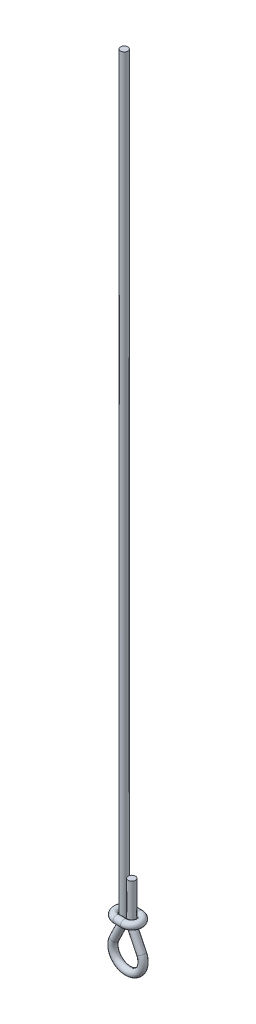
ISO-10303-21;
HEADER;
FILE_DESCRIPTION(('STEP AP214'),'2;1');
FILE_NAME('part.step','',(''),(''),'','','');
FILE_SCHEMA(('AUTOMOTIVE_DESIGN { 1 0 10303 214 1 1 1 1 }'));
ENDSEC;
DATA;
#1=APPLICATION_CONTEXT('core data for automotive mechanical design processes');
#2=APPLICATION_PROTOCOL_DEFINITION('international standard','automotive_design',2000,#1);
#3=PRODUCT_CONTEXT('',#1,'mechanical');
#4=PRODUCT('Part','Part','',(#3));
#5=PRODUCT_RELATED_PRODUCT_CATEGORY('part','',(#4));
#6=PRODUCT_DEFINITION_FORMATION('','',#4);
#7=PRODUCT_DEFINITION_CONTEXT('part definition',#1,'design');
#8=PRODUCT_DEFINITION('design','',#6,#7);
#9=PRODUCT_DEFINITION_SHAPE('','',#8);
#10=(LENGTH_UNIT() NAMED_UNIT(*) SI_UNIT(.MILLI.,.METRE.));
#11=(NAMED_UNIT(*) PLANE_ANGLE_UNIT() SI_UNIT($,.RADIAN.));
#12=(NAMED_UNIT(*) SI_UNIT($,.STERADIAN.) SOLID_ANGLE_UNIT());
#13=UNCERTAINTY_MEASURE_WITH_UNIT(LENGTH_MEASURE(1.E-05),#10,'distance_accuracy_value','');
#14=(GEOMETRIC_REPRESENTATION_CONTEXT(3) GLOBAL_UNCERTAINTY_ASSIGNED_CONTEXT((#13)) GLOBAL_UNIT_ASSIGNED_CONTEXT((#10,
#11,#12)) REPRESENTATION_CONTEXT('',''));
#15=CARTESIAN_POINT('',(0.,0.,0.));
#16=DIRECTION('',(0.,0.,1.));
#17=DIRECTION('',(1.,0.,0.));
#18=AXIS2_PLACEMENT_3D('',#15,#16,#17);
#19=CARTESIAN_POINT('',(1.5,1.,0.));
#20=DIRECTION('',(0.,-1.,0.));
#21=DIRECTION('',(0.,0.,-1.));
#22=AXIS2_PLACEMENT_3D('',#19,#20,#21);
#23=TOROIDAL_SURFACE('',#22,1.5,0.725);
#24=CARTESIAN_POINT('',(1.5,1.,-1.5));
#25=DIRECTION('',(-1.,0.,0.));
#26=DIRECTION('',(0.,0.,1.));
#27=AXIS2_PLACEMENT_3D('',#24,#25,#26);
#28=CIRCLE('',#27,0.725);
#29=CARTESIAN_POINT('',(1.5,1.,-2.225));
#30=VERTEX_POINT('',#29);
#31=EDGE_CURVE('E84',#30,#30,#28,.T.);
#32=CARTESIAN_POINT('',(1.5,1.,1.5));
#33=DIRECTION('',(1.,0.,0.));
#34=DIRECTION('',(0.,0.,-1.));
#35=AXIS2_PLACEMENT_3D('',#32,#33,#34);
#36=CIRCLE('',#35,0.725);
#37=CARTESIAN_POINT('',(1.5,1.,2.225));
#38=VERTEX_POINT('',#37);
#39=EDGE_CURVE('E80',#38,#38,#36,.T.);
#40=CARTESIAN_POINT('',(1.5,1.,0.));
#41=DIRECTION('',(0.,-1.,0.));
#42=DIRECTION('',(0.,0.,-1.));
#43=AXIS2_PLACEMENT_3D('',#40,#41,#42);
#44=CIRCLE('',#43,2.225);
#45=EDGE_CURVE('',#30,#38,#44,.T.);
#46=ORIENTED_EDGE('',*,*,#31,.F.);
#47=ORIENTED_EDGE('',*,*,#39,.T.);
#48=ORIENTED_EDGE('',*,*,#45,.T.);
#49=ORIENTED_EDGE('',*,*,#45,.F.);
#50=EDGE_LOOP('',(#46,#48,#47,#49));
#51=FACE_BOUND('',#50,.T.);
#52=ADVANCED_FACE('F69',(#51),#23,.T.);
#53=CARTESIAN_POINT('',(1.5,1.,1.5));
#54=DIRECTION('',(-1.,0.,0.));
#55=DIRECTION('',(0.,0.,1.));
#56=AXIS2_PLACEMENT_3D('',#53,#54,#55);
#57=CYLINDRICAL_SURFACE('',#56,0.725);
#58=CARTESIAN_POINT('',(0.,1.,1.5));
#59=DIRECTION('',(1.,0.,0.));
#60=DIRECTION('',(0.,0.,-1.));
#61=AXIS2_PLACEMENT_3D('',#58,#59,#60);
#62=CIRCLE('',#61,0.725);
#63=CARTESIAN_POINT('',(0.,1.,2.225));
#64=VERTEX_POINT('',#63);
#65=EDGE_CURVE('E76',#64,#64,#62,.T.);
#66=ORIENTED_EDGE('',*,*,#65,.T.);
#67=EDGE_LOOP('',(#66));
#68=FACE_BOUND('',#67,.T.);
#69=ORIENTED_EDGE('',*,*,#39,.F.);
#70=EDGE_LOOP('',(#69));
#71=FACE_BOUND('',#70,.T.);
#72=ADVANCED_FACE('F93',(#68,#71),#57,.T.);
#73=CARTESIAN_POINT('',(0.,1.,0.));
#74=DIRECTION('',(0.,-1.,0.));
#75=DIRECTION('',(0.,0.,-1.));
#76=AXIS2_PLACEMENT_3D('',#73,#74,#75);
#77=TOROIDAL_SURFACE('',#76,1.5,0.725);
#78=CARTESIAN_POINT('',(0.,1.,-1.5));
#79=DIRECTION('',(-1.,0.,0.));
#80=DIRECTION('',(0.,0.,1.));
#81=AXIS2_PLACEMENT_3D('',#78,#79,#80);
#82=CIRCLE('',#81,0.725);
#83=CARTESIAN_POINT('',(0.,1.,-2.225));
#84=VERTEX_POINT('',#83);
#85=EDGE_CURVE('E12',#84,#84,#82,.T.);
#86=CARTESIAN_POINT('',(0.,1.,0.));
#87=DIRECTION('',(0.,-1.,0.));
#88=DIRECTION('',(0.,0.,-1.));
#89=AXIS2_PLACEMENT_3D('',#86,#87,#88);
#90=CIRCLE('',#89,2.225);
#91=EDGE_CURVE('',#64,#84,#90,.T.);
#92=ORIENTED_EDGE('',*,*,#65,.F.);
#93=ORIENTED_EDGE('',*,*,#85,.T.);
#94=ORIENTED_EDGE('',*,*,#91,.T.);
#95=ORIENTED_EDGE('',*,*,#91,.F.);
#96=EDGE_LOOP('',(#92,#94,#93,#95));
#97=FACE_BOUND('',#96,.T.);
#98=ADVANCED_FACE('F99',(#97),#77,.T.);
#99=CARTESIAN_POINT('',(0.,1.,-1.5));
#100=DIRECTION('',(1.,0.,0.));
#101=DIRECTION('',(0.,0.,-1.));
#102=AXIS2_PLACEMENT_3D('',#99,#100,#101);
#103=CYLINDRICAL_SURFACE('',#102,0.725);
#104=ORIENTED_EDGE('',*,*,#31,.T.);
#105=EDGE_LOOP('',(#104));
#106=FACE_BOUND('',#105,.T.);
#107=ORIENTED_EDGE('',*,*,#85,.F.);
#108=EDGE_LOOP('',(#107));
#109=FACE_BOUND('',#108,.T.);
#110=ADVANCED_FACE('F71',(#106,#109),#103,.T.);
#111=CLOSED_SHELL('',(#52,#72,#98,#110));
#112=MANIFOLD_SOLID_BREP('B2',#111);
#113=CARTESIAN_POINT('',(1.5,8.,0.));
#114=DIRECTION('',(0.,-1.,0.));
#115=DIRECTION('',(0.,0.,-1.));
#116=AXIS2_PLACEMENT_3D('',#113,#114,#115);
#117=PLANE('',#116);
#118=CARTESIAN_POINT('',(1.5,8.,0.));
#119=DIRECTION('',(0.,-1.,0.));
#120=DIRECTION('',(0.,0.,-1.));
#121=AXIS2_PLACEMENT_3D('',#118,#119,#120);
#122=CIRCLE('',#121,0.725);
#123=CARTESIAN_POINT('',(1.5,8.,-0.725));
#124=VERTEX_POINT('',#123);
#125=EDGE_CURVE('E142',#124,#124,#122,.T.);
#126=ORIENTED_EDGE('',*,*,#125,.F.);
#127=EDGE_LOOP('',(#126));
#128=FACE_BOUND('',#127,.T.);
#129=ADVANCED_FACE('F139',(#128),#117,.F.);
#130=CARTESIAN_POINT('',(0.,150.,0.));
#131=DIRECTION('',(0.,1.,0.));
#132=DIRECTION('',(0.,0.,-1.));
#133=AXIS2_PLACEMENT_3D('',#130,#131,#132);
#134=PLANE('',#133);
#135=CARTESIAN_POINT('',(0.,150.,0.));
#136=DIRECTION('',(0.,1.,0.));
#137=DIRECTION('',(0.,0.,-1.));
#138=AXIS2_PLACEMENT_3D('',#135,#136,#137);
#139=CIRCLE('',#138,0.725);
#140=CARTESIAN_POINT('',(0.,150.,-0.725));
#141=VERTEX_POINT('',#140);
#142=EDGE_CURVE('E146',#141,#141,#139,.T.);
#143=ORIENTED_EDGE('',*,*,#142,.T.);
#144=EDGE_LOOP('',(#143));
#145=FACE_BOUND('',#144,.T.);
#146=ADVANCED_FACE('F179',(#145),#134,.T.);
#147=CARTESIAN_POINT('',(1.5,-0.467624888717495,0.));
#148=DIRECTION('',(0.,1.,0.));
#149=DIRECTION('',(0.,0.,1.));
#150=AXIS2_PLACEMENT_3D('',#147,#148,#149);
#151=CYLINDRICAL_SURFACE('',#150,0.725);
#152=CARTESIAN_POINT('',(1.5,0.,0.));
#153=DIRECTION('',(-0.224597295491527,0.974451668815797,0.));
#154=DIRECTION('',(-0.974451668815797,-0.224597295491527,0.));
#155=AXIS2_PLACEMENT_3D('',#152,#153,#154);
#156=ELLIPSE('',#155,0.744008167055691,0.725);
#157=CARTESIAN_POINT('',(0.774999999999998,-0.167102222144317,0.));
#158=VERTEX_POINT('',#157);
#159=EDGE_CURVE('E157',#158,#158,#156,.T.);
#160=ORIENTED_EDGE('',*,*,#159,.T.);
#161=EDGE_LOOP('',(#160));
#162=FACE_BOUND('',#161,.T.);
#163=ORIENTED_EDGE('',*,*,#125,.T.);
#164=EDGE_LOOP('',(#163));
#165=FACE_BOUND('',#164,.T.);
#166=ADVANCED_FACE('F173',(#162,#165),#151,.T.);
#167=CARTESIAN_POINT('',(3.44733632914735,-4.00000000000001,0.));
#168=DIRECTION('',(-0.437718418806466,0.899112109715784,0.));
#169=DIRECTION('',(-0.899112109715784,-0.437718418806466,0.));
#170=AXIS2_PLACEMENT_3D('',#167,#168,#169);
#171=CYLINDRICAL_SURFACE('',#170,0.725);
#172=CARTESIAN_POINT('',(3.44733632914735,-4.,0.));
#173=DIRECTION('',(0.437718418806466,-0.899112109715784,0.));
#174=DIRECTION('',(0.,0.,-1.));
#175=AXIS2_PLACEMENT_3D('',#172,#173,#174);
#176=CIRCLE('',#175,0.725);
#177=CARTESIAN_POINT('',(4.0991926086913,-3.68265414636532,0.));
#178=VERTEX_POINT('',#177);
#179=EDGE_CURVE('E154',#178,#178,#176,.T.);
#180=ORIENTED_EDGE('',*,*,#179,.F.);
#181=EDGE_LOOP('',(#180));
#182=FACE_BOUND('',#181,.T.);
#183=ORIENTED_EDGE('',*,*,#159,.F.);
#184=EDGE_LOOP('',(#183));
#185=FACE_BOUND('',#184,.T.);
#186=ADVANCED_FACE('F167',(#182,#185),#171,.T.);
#187=CARTESIAN_POINT('',(0.75,-5.3131552564194,0.));
#188=DIRECTION('',(0.,0.,1.));
#189=DIRECTION('',(1.,0.,0.));
#190=AXIS2_PLACEMENT_3D('',#187,#188,#189);
#191=TOROIDAL_SURFACE('',#190,3.,0.725);
#192=CARTESIAN_POINT('',(-1.94733632914735,-4.,0.));
#193=DIRECTION('',(0.437718418806466,0.899112109715784,0.));
#194=DIRECTION('',(0.,0.,-1.));
#195=AXIS2_PLACEMENT_3D('',#192,#193,#194);
#196=CIRCLE('',#195,0.725);
#197=CARTESIAN_POINT('',(-2.59919260869129,-3.68265414636531,0.));
#198=VERTEX_POINT('',#197);
#199=EDGE_CURVE('E151',#198,#198,#196,.T.);
#200=CARTESIAN_POINT('',(0.75,-5.3131552564194,0.));
#201=DIRECTION('',(0.,0.,1.));
#202=DIRECTION('',(1.,0.,0.));
#203=AXIS2_PLACEMENT_3D('',#200,#201,#202);
#204=CIRCLE('',#203,3.725);
#205=EDGE_CURVE('',#198,#178,#204,.T.);
#206=ORIENTED_EDGE('',*,*,#199,.F.);
#207=ORIENTED_EDGE('',*,*,#179,.T.);
#208=ORIENTED_EDGE('',*,*,#205,.T.);
#209=ORIENTED_EDGE('',*,*,#205,.F.);
#210=EDGE_LOOP('',(#206,#208,#207,#209));
#211=FACE_BOUND('',#210,.T.);
#212=ADVANCED_FACE('F164',(#211),#191,.T.);
#213=CARTESIAN_POINT('',(0.204688026883972,0.420447200250397,0.));
#214=DIRECTION('',(-0.437718418806466,-0.899112109715783,0.));
#215=DIRECTION('',(0.899112109715784,-0.437718418806466,0.));
#216=AXIS2_PLACEMENT_3D('',#213,#214,#215);
#217=CYLINDRICAL_SURFACE('',#216,0.725);
#218=CARTESIAN_POINT('',(0.,0.,0.));
#219=DIRECTION('',(-0.224597295491527,-0.974451668815797,0.));
#220=DIRECTION('',(0.974451668815797,-0.224597295491527,0.));
#221=AXIS2_PLACEMENT_3D('',#218,#219,#220);
#222=ELLIPSE('',#221,0.744008167055691,0.725);
#223=CARTESIAN_POINT('',(0.725,-0.167102222144316,0.));
#224=VERTEX_POINT('',#223);
#225=EDGE_CURVE('E68',#224,#224,#222,.T.);
#226=ORIENTED_EDGE('',*,*,#225,.T.);
#227=EDGE_LOOP('',(#226));
#228=FACE_BOUND('',#227,.T.);
#229=ORIENTED_EDGE('',*,*,#199,.T.);
#230=EDGE_LOOP('',(#229));
#231=FACE_BOUND('',#230,.T.);
#232=ADVANCED_FACE('F162',(#228,#231),#217,.T.);
#233=CARTESIAN_POINT('',(0.,150.,0.));
#234=DIRECTION('',(0.,-1.,0.));
#235=DIRECTION('',(0.,0.,-1.));
#236=AXIS2_PLACEMENT_3D('',#233,#234,#235);
#237=CYLINDRICAL_SURFACE('',#236,0.725);
#238=ORIENTED_EDGE('',*,*,#142,.F.);
#239=EDGE_LOOP('',(#238));
#240=FACE_BOUND('',#239,.T.);
#241=ORIENTED_EDGE('',*,*,#225,.F.);
#242=EDGE_LOOP('',(#241));
#243=FACE_BOUND('',#242,.T.);
#244=ADVANCED_FACE('F189',(#240,#243),#237,.T.);
#245=CLOSED_SHELL('',(#129,#146,#166,#186,#212,#232,#244));
#246=MANIFOLD_SOLID_BREP('B7',#245);
#247=ADVANCED_BREP_SHAPE_REPRESENTATION('',(#18,#112,#246),#14);
#248=SHAPE_DEFINITION_REPRESENTATION(#9,#247);
ENDSEC;
END-ISO-10303-21;
